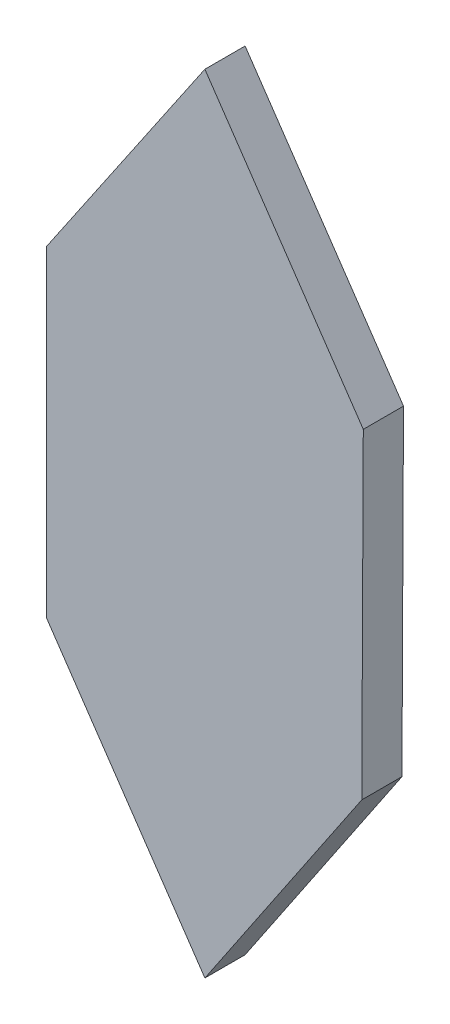
ISO-10303-21;
HEADER;
FILE_DESCRIPTION(('STEP AP214'),'2;1');
FILE_NAME('part.step','',(''),(''),'','','');
FILE_SCHEMA(('AUTOMOTIVE_DESIGN { 1 0 10303 214 1 1 1 1 }'));
ENDSEC;
DATA;
#1=APPLICATION_CONTEXT('core data for automotive mechanical design processes');
#2=APPLICATION_PROTOCOL_DEFINITION('international standard','automotive_design',2000,#1);
#3=PRODUCT_CONTEXT('',#1,'mechanical');
#4=PRODUCT('Part','Part','',(#3));
#5=PRODUCT_RELATED_PRODUCT_CATEGORY('part','',(#4));
#6=PRODUCT_DEFINITION_FORMATION('','',#4);
#7=PRODUCT_DEFINITION_CONTEXT('part definition',#1,'design');
#8=PRODUCT_DEFINITION('design','',#6,#7);
#9=PRODUCT_DEFINITION_SHAPE('','',#8);
#10=(LENGTH_UNIT() NAMED_UNIT(*) SI_UNIT(.MILLI.,.METRE.));
#11=(NAMED_UNIT(*) PLANE_ANGLE_UNIT() SI_UNIT($,.RADIAN.));
#12=(NAMED_UNIT(*) SI_UNIT($,.STERADIAN.) SOLID_ANGLE_UNIT());
#13=UNCERTAINTY_MEASURE_WITH_UNIT(LENGTH_MEASURE(1.E-05),#10,'distance_accuracy_value','');
#14=(GEOMETRIC_REPRESENTATION_CONTEXT(3) GLOBAL_UNCERTAINTY_ASSIGNED_CONTEXT((#13)) GLOBAL_UNIT_ASSIGNED_CONTEXT((#10,
#11,#12)) REPRESENTATION_CONTEXT('',''));
#15=CARTESIAN_POINT('',(0.,0.,0.));
#16=DIRECTION('',(0.,0.,1.));
#17=DIRECTION('',(1.,0.,0.));
#18=AXIS2_PLACEMENT_3D('',#15,#16,#17);
#19=CARTESIAN_POINT('',(0.,0.,5.));
#20=DIRECTION('',(0.829176321294411,-0.558987144936865,0.));
#21=DIRECTION('',(0.558987144936865,0.829176321294411,0.));
#22=AXIS2_PLACEMENT_3D('',#19,#20,#21);
#23=PLANE('',#22);
#24=DIRECTION('',(-0.558987144936865,-0.829176321294411,0.));
#25=VECTOR('',#24,1.);
#26=CARTESIAN_POINT('',(0.,0.,0.));
#27=LINE('',#26,#25);
#28=CARTESIAN_POINT('',(0.,0.,0.));
#29=VERTEX_POINT('',#28);
#30=CARTESIAN_POINT('',(-19.5048483191511,-28.932612356418,0.));
#31=VERTEX_POINT('',#30);
#32=EDGE_CURVE('E116',#29,#31,#27,.T.);
#33=ORIENTED_EDGE('',*,*,#32,.F.);
#34=DIRECTION('',(0.,0.,-1.));
#35=VECTOR('',#34,1.);
#36=CARTESIAN_POINT('',(0.,0.,5.));
#37=LINE('',#36,#35);
#38=CARTESIAN_POINT('',(0.,0.,5.));
#39=VERTEX_POINT('',#38);
#40=EDGE_CURVE('E11',#39,#29,#37,.T.);
#41=ORIENTED_EDGE('',*,*,#40,.F.);
#42=DIRECTION('',(-0.558987144936865,-0.829176321294411,0.));
#43=VECTOR('',#42,1.);
#44=CARTESIAN_POINT('',(0.,0.,5.));
#45=LINE('',#44,#43);
#46=CARTESIAN_POINT('',(-19.5048483191511,-28.932612356418,5.));
#47=VERTEX_POINT('',#46);
#48=EDGE_CURVE('E130',#39,#47,#45,.T.);
#49=ORIENTED_EDGE('',*,*,#48,.T.);
#50=DIRECTION('',(0.,0.,-1.));
#51=VECTOR('',#50,1.);
#52=CARTESIAN_POINT('',(-19.5048483191511,-28.932612356418,5.));
#53=LINE('',#52,#51);
#54=EDGE_CURVE('E79',#47,#31,#53,.T.);
#55=ORIENTED_EDGE('',*,*,#54,.T.);
#56=EDGE_LOOP('',(#33,#41,#49,#55));
#57=FACE_BOUND('',#56,.T.);
#58=ADVANCED_FACE('F35',(#57),#23,.T.);
#59=CARTESIAN_POINT('',(0.,0.,5.));
#60=DIRECTION('',(0.999988667960836,-0.00476066696086244,0.));
#61=DIRECTION('',(0.00476066696086244,0.999988667960836,0.));
#62=AXIS2_PLACEMENT_3D('',#59,#60,#61);
#63=PLANE('',#62);
#64=DIRECTION('',(-0.00476066696086244,-0.999988667960837,0.));
#65=VECTOR('',#64,1.);
#66=CARTESIAN_POINT('',(0.,0.,0.));
#67=LINE('',#66,#65);
#68=CARTESIAN_POINT('',(0.190428836381529,40.,0.));
#69=VERTEX_POINT('',#68);
#70=EDGE_CURVE('E119',#69,#29,#67,.T.);
#71=ORIENTED_EDGE('',*,*,#70,.F.);
#72=DIRECTION('',(0.,0.,-1.));
#73=VECTOR('',#72,1.);
#74=CARTESIAN_POINT('',(0.190428836381529,40.,5.));
#75=LINE('',#74,#73);
#76=CARTESIAN_POINT('',(0.190428836381529,40.,5.));
#77=VERTEX_POINT('',#76);
#78=EDGE_CURVE('E43',#77,#69,#75,.T.);
#79=ORIENTED_EDGE('',*,*,#78,.F.);
#80=DIRECTION('',(-0.00476066696086244,-0.999988667960837,0.));
#81=VECTOR('',#80,1.);
#82=CARTESIAN_POINT('',(0.,0.,5.));
#83=LINE('',#82,#81);
#84=EDGE_CURVE('E143',#77,#39,#83,.T.);
#85=ORIENTED_EDGE('',*,*,#84,.T.);
#86=ORIENTED_EDGE('',*,*,#40,.T.);
#87=EDGE_LOOP('',(#71,#79,#85,#86));
#88=FACE_BOUND('',#87,.T.);
#89=ADVANCED_FACE('F139',(#88),#63,.T.);
#90=CARTESIAN_POINT('',(18.7370122415916,12.7548333561692,5.));
#91=DIRECTION('',(0.82664606732623,0.56272220444379,0.));
#92=DIRECTION('',(-0.56272220444379,0.82664606732623,0.));
#93=AXIS2_PLACEMENT_3D('',#90,#91,#92);
#94=PLANE('',#93);
#95=DIRECTION('',(0.56272220444379,-0.82664606732623,0.));
#96=VECTOR('',#95,1.);
#97=CARTESIAN_POINT('',(18.7370122415916,12.7548333561692,0.));
#98=LINE('',#97,#96);
#99=CARTESIAN_POINT('',(-19.5048483191511,68.932612356418,0.));
#100=VERTEX_POINT('',#99);
#101=EDGE_CURVE('E122',#100,#69,#98,.T.);
#102=ORIENTED_EDGE('',*,*,#101,.F.);
#103=DIRECTION('',(0.,0.,-1.));
#104=VECTOR('',#103,1.);
#105=CARTESIAN_POINT('',(-19.5048483191511,68.932612356418,5.));
#106=LINE('',#105,#104);
#107=CARTESIAN_POINT('',(-19.5048483191511,68.932612356418,5.));
#108=VERTEX_POINT('',#107);
#109=EDGE_CURVE('E102',#108,#100,#106,.T.);
#110=ORIENTED_EDGE('',*,*,#109,.F.);
#111=DIRECTION('',(0.56272220444379,-0.82664606732623,0.));
#112=VECTOR('',#111,1.);
#113=CARTESIAN_POINT('',(18.7370122415916,12.7548333561692,5.));
#114=LINE('',#113,#112);
#115=EDGE_CURVE('E109',#108,#77,#114,.T.);
#116=ORIENTED_EDGE('',*,*,#115,.T.);
#117=ORIENTED_EDGE('',*,*,#78,.T.);
#118=EDGE_LOOP('',(#102,#110,#116,#117));
#119=FACE_BOUND('',#118,.T.);
#120=ADVANCED_FACE('F136',(#119),#94,.T.);
#121=CARTESIAN_POINT('',(-45.3940434828976,30.9010557564687,5.));
#122=DIRECTION('',(-0.82664606732623,0.56272220444379,0.));
#123=DIRECTION('',(-0.56272220444379,-0.82664606732623,0.));
#124=AXIS2_PLACEMENT_3D('',#121,#122,#123);
#125=PLANE('',#124);
#126=DIRECTION('',(0.56272220444379,0.82664606732623,0.));
#127=VECTOR('',#126,1.);
#128=CARTESIAN_POINT('',(-45.3940434828976,30.9010557564687,0.));
#129=LINE('',#128,#127);
#130=CARTESIAN_POINT('',(-39.2001254746838,40.,0.));
#131=VERTEX_POINT('',#130);
#132=EDGE_CURVE('E97',#131,#100,#129,.T.);
#133=ORIENTED_EDGE('',*,*,#132,.F.);
#134=DIRECTION('',(0.,0.,-1.));
#135=VECTOR('',#134,1.);
#136=CARTESIAN_POINT('',(-39.2001254746838,40.,5.));
#137=LINE('',#136,#135);
#138=CARTESIAN_POINT('',(-39.2001254746838,40.,5.));
#139=VERTEX_POINT('',#138);
#140=EDGE_CURVE('E92',#139,#131,#137,.T.);
#141=ORIENTED_EDGE('',*,*,#140,.F.);
#142=DIRECTION('',(0.56272220444379,0.82664606732623,0.));
#143=VECTOR('',#142,1.);
#144=CARTESIAN_POINT('',(-45.3940434828976,30.9010557564687,5.));
#145=LINE('',#144,#143);
#146=EDGE_CURVE('E95',#139,#108,#145,.T.);
#147=ORIENTED_EDGE('',*,*,#146,.T.);
#148=ORIENTED_EDGE('',*,*,#109,.T.);
#149=EDGE_LOOP('',(#133,#141,#147,#148));
#150=FACE_BOUND('',#149,.T.);
#151=ADVANCED_FACE('F94',(#150),#125,.T.);
#152=CARTESIAN_POINT('',(-39.2001254746838,0.,5.));
#153=DIRECTION('',(-1.,0.,0.));
#154=DIRECTION('',(0.,0.,1.));
#155=AXIS2_PLACEMENT_3D('',#152,#153,#154);
#156=PLANE('',#155);
#157=DIRECTION('',(0.,1.,0.));
#158=VECTOR('',#157,1.);
#159=CARTESIAN_POINT('',(-39.2001254746838,0.,0.));
#160=LINE('',#159,#158);
#161=CARTESIAN_POINT('',(-39.2001254746838,0.,0.));
#162=VERTEX_POINT('',#161);
#163=EDGE_CURVE('E126',#162,#131,#160,.T.);
#164=ORIENTED_EDGE('',*,*,#163,.F.);
#165=DIRECTION('',(0.,0.,-1.));
#166=VECTOR('',#165,1.);
#167=CARTESIAN_POINT('',(-39.2001254746838,0.,5.));
#168=LINE('',#167,#166);
#169=CARTESIAN_POINT('',(-39.2001254746838,0.,5.));
#170=VERTEX_POINT('',#169);
#171=EDGE_CURVE('E72',#170,#162,#168,.T.);
#172=ORIENTED_EDGE('',*,*,#171,.F.);
#173=DIRECTION('',(0.,1.,0.));
#174=VECTOR('',#173,1.);
#175=CARTESIAN_POINT('',(-39.2001254746838,0.,5.));
#176=LINE('',#175,#174);
#177=EDGE_CURVE('E106',#170,#139,#176,.T.);
#178=ORIENTED_EDGE('',*,*,#177,.T.);
#179=ORIENTED_EDGE('',*,*,#140,.T.);
#180=EDGE_LOOP('',(#164,#172,#178,#179));
#181=FACE_BOUND('',#180,.T.);
#182=ADVANCED_FACE('F111',(#181),#156,.T.);
#183=CARTESIAN_POINT('',(-26.7871595908734,-18.2348045815055,5.));
#184=DIRECTION('',(0.82664606732623,0.56272220444379,0.));
#185=DIRECTION('',(-0.56272220444379,0.82664606732623,0.));
#186=AXIS2_PLACEMENT_3D('',#183,#184,#185);
#187=PLANE('',#186);
#188=DIRECTION('',(0.56272220444379,-0.82664606732623,0.));
#189=VECTOR('',#188,1.);
#190=CARTESIAN_POINT('',(-26.7871595908734,-18.2348045815055,0.));
#191=LINE('',#190,#189);
#192=EDGE_CURVE('E128',#162,#31,#191,.T.);
#193=ORIENTED_EDGE('',*,*,#192,.T.);
#194=ORIENTED_EDGE('',*,*,#54,.F.);
#195=DIRECTION('',(0.56272220444379,-0.82664606732623,0.));
#196=VECTOR('',#195,1.);
#197=CARTESIAN_POINT('',(-26.7871595908734,-18.2348045815055,5.));
#198=LINE('',#197,#196);
#199=EDGE_CURVE('E51',#170,#47,#198,.T.);
#200=ORIENTED_EDGE('',*,*,#199,.F.);
#201=ORIENTED_EDGE('',*,*,#171,.T.);
#202=EDGE_LOOP('',(#193,#194,#200,#201));
#203=FACE_BOUND('',#202,.T.);
#204=ADVANCED_FACE('F142',(#203),#187,.F.);
#205=CARTESIAN_POINT('',(0.,0.,5.));
#206=DIRECTION('',(0.,0.,1.));
#207=DIRECTION('',(1.,0.,0.));
#208=AXIS2_PLACEMENT_3D('',#205,#206,#207);
#209=PLANE('',#208);
#210=ORIENTED_EDGE('',*,*,#48,.F.);
#211=ORIENTED_EDGE('',*,*,#84,.F.);
#212=ORIENTED_EDGE('',*,*,#115,.F.);
#213=ORIENTED_EDGE('',*,*,#146,.F.);
#214=ORIENTED_EDGE('',*,*,#177,.F.);
#215=ORIENTED_EDGE('',*,*,#199,.T.);
#216=EDGE_LOOP('',(#210,#211,#212,#213,#214,#215));
#217=FACE_BOUND('',#216,.T.);
#218=ADVANCED_FACE('F105',(#217),#209,.T.);
#219=CARTESIAN_POINT('',(0.,0.,0.));
#220=DIRECTION('',(0.,0.,1.));
#221=DIRECTION('',(1.,0.,0.));
#222=AXIS2_PLACEMENT_3D('',#219,#220,#221);
#223=PLANE('',#222);
#224=ORIENTED_EDGE('',*,*,#32,.T.);
#225=ORIENTED_EDGE('',*,*,#192,.F.);
#226=ORIENTED_EDGE('',*,*,#163,.T.);
#227=ORIENTED_EDGE('',*,*,#132,.T.);
#228=ORIENTED_EDGE('',*,*,#101,.T.);
#229=ORIENTED_EDGE('',*,*,#70,.T.);
#230=EDGE_LOOP('',(#224,#225,#226,#227,#228,#229));
#231=FACE_BOUND('',#230,.T.);
#232=ADVANCED_FACE('F141',(#231),#223,.F.);
#233=CLOSED_SHELL('',(#58,#89,#120,#151,#182,#204,#218,#232));
#234=MANIFOLD_SOLID_BREP('B2',#233);
#235=ADVANCED_BREP_SHAPE_REPRESENTATION('',(#18,#234),#14);
#236=SHAPE_DEFINITION_REPRESENTATION(#9,#235);
ENDSEC;
END-ISO-10303-21;
